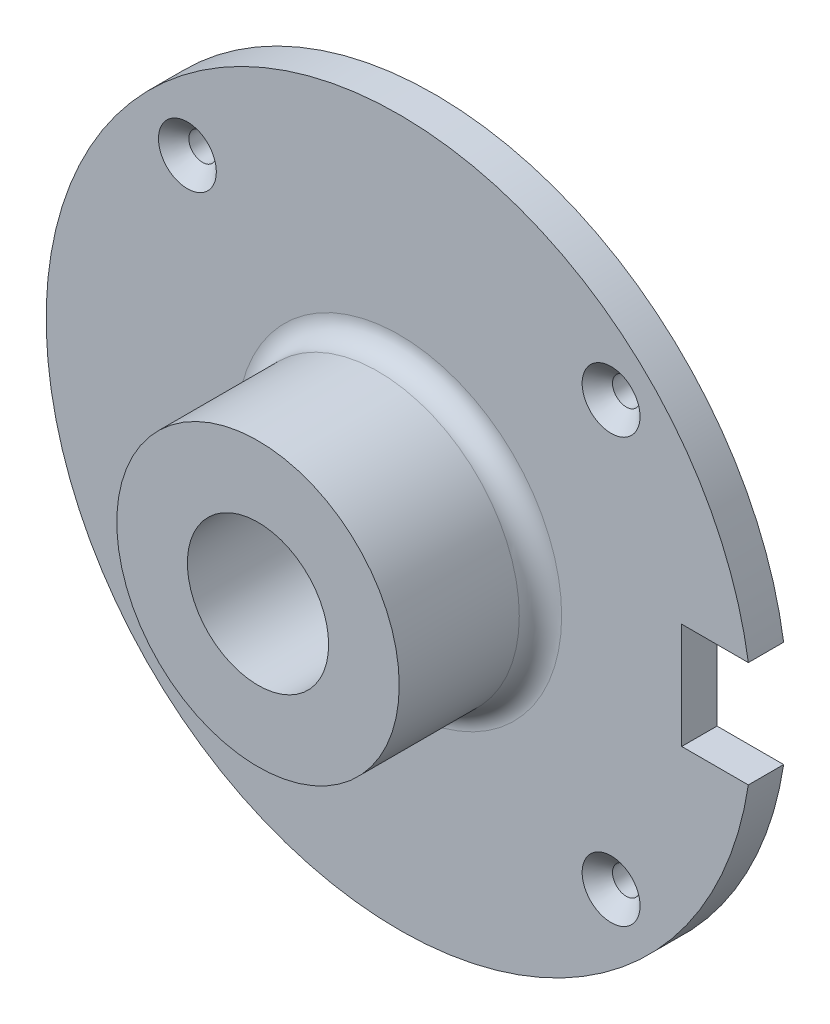
ISO-10303-21;
HEADER;
FILE_DESCRIPTION(('STEP AP214'),'2;1');
FILE_NAME('part.step','',(''),(''),'','','');
FILE_SCHEMA(('AUTOMOTIVE_DESIGN { 1 0 10303 214 1 1 1 1 }'));
ENDSEC;
DATA;
#1=APPLICATION_CONTEXT('core data for automotive mechanical design processes');
#2=APPLICATION_PROTOCOL_DEFINITION('international standard','automotive_design',2000,#1);
#3=PRODUCT_CONTEXT('',#1,'mechanical');
#4=PRODUCT('Part','Part','',(#3));
#5=PRODUCT_RELATED_PRODUCT_CATEGORY('part','',(#4));
#6=PRODUCT_DEFINITION_FORMATION('','',#4);
#7=PRODUCT_DEFINITION_CONTEXT('part definition',#1,'design');
#8=PRODUCT_DEFINITION('design','',#6,#7);
#9=PRODUCT_DEFINITION_SHAPE('','',#8);
#10=(LENGTH_UNIT() NAMED_UNIT(*) SI_UNIT(.MILLI.,.METRE.));
#11=(NAMED_UNIT(*) PLANE_ANGLE_UNIT() SI_UNIT($,.RADIAN.));
#12=(NAMED_UNIT(*) SI_UNIT($,.STERADIAN.) SOLID_ANGLE_UNIT());
#13=UNCERTAINTY_MEASURE_WITH_UNIT(LENGTH_MEASURE(1.E-05),#10,'distance_accuracy_value','');
#14=(GEOMETRIC_REPRESENTATION_CONTEXT(3) GLOBAL_UNCERTAINTY_ASSIGNED_CONTEXT((#13)) GLOBAL_UNIT_ASSIGNED_CONTEXT((#10,
#11,#12)) REPRESENTATION_CONTEXT('',''));
#15=CARTESIAN_POINT('',(0.,0.,0.));
#16=DIRECTION('',(0.,0.,1.));
#17=DIRECTION('',(1.,0.,0.));
#18=AXIS2_PLACEMENT_3D('',#15,#16,#17);
#19=CARTESIAN_POINT('',(0.,0.,50.));
#20=DIRECTION('',(0.,0.,1.));
#21=DIRECTION('',(1.,0.,0.));
#22=AXIS2_PLACEMENT_3D('',#19,#20,#21);
#23=CYLINDRICAL_SURFACE('',#22,50.);
#24=CARTESIAN_POINT('',(0.,0.,5.));
#25=DIRECTION('',(0.,0.,1.));
#26=DIRECTION('',(1.,0.,0.));
#27=AXIS2_PLACEMENT_3D('',#24,#25,#26);
#28=CIRCLE('',#27,50.);
#29=CARTESIAN_POINT('',(49.434299833213,7.5,5.));
#30=VERTEX_POINT('',#29);
#31=CARTESIAN_POINT('',(49.434299833213,-7.5,5.));
#32=VERTEX_POINT('',#31);
#33=EDGE_CURVE('E125',#30,#32,#28,.T.);
#34=ORIENTED_EDGE('',*,*,#33,.F.);
#35=DIRECTION('',(0.,0.,1.));
#36=VECTOR('',#35,1.);
#37=CARTESIAN_POINT('',(49.434299833213,7.5,50.));
#38=LINE('',#37,#36);
#39=CARTESIAN_POINT('',(49.434299833213,7.5,0.));
#40=VERTEX_POINT('',#39);
#41=EDGE_CURVE('E108',#30,#40,#38,.F.);
#42=ORIENTED_EDGE('',*,*,#41,.T.);
#43=CARTESIAN_POINT('',(0.,0.,0.));
#44=DIRECTION('',(0.,0.,1.));
#45=DIRECTION('',(1.,0.,0.));
#46=AXIS2_PLACEMENT_3D('',#43,#44,#45);
#47=CIRCLE('',#46,50.);
#48=CARTESIAN_POINT('',(49.434299833213,-7.5,0.));
#49=VERTEX_POINT('',#48);
#50=EDGE_CURVE('E46',#40,#49,#47,.T.);
#51=ORIENTED_EDGE('',*,*,#50,.T.);
#52=DIRECTION('',(0.,0.,1.));
#53=VECTOR('',#52,1.);
#54=CARTESIAN_POINT('',(49.434299833213,-7.5,50.));
#55=LINE('',#54,#53);
#56=EDGE_CURVE('E91',#49,#32,#55,.T.);
#57=ORIENTED_EDGE('',*,*,#56,.T.);
#58=EDGE_LOOP('',(#34,#42,#51,#57));
#59=FACE_BOUND('',#58,.T.);
#60=ADVANCED_FACE('F38',(#59),#23,.T.);
#61=CARTESIAN_POINT('',(0.,50.,0.));
#62=DIRECTION('',(0.,0.,1.));
#63=DIRECTION('',(1.,0.,0.));
#64=AXIS2_PLACEMENT_3D('',#61,#62,#63);
#65=PLANE('',#64);
#66=CARTESIAN_POINT('',(29.9999999999997,30.0000000000003,0.));
#67=DIRECTION('',(0.,0.,1.));
#68=DIRECTION('',(1.,0.,0.));
#69=AXIS2_PLACEMENT_3D('',#66,#67,#68);
#70=CIRCLE('',#69,1.95);
#71=CARTESIAN_POINT('',(31.9499999999997,30.0000000000003,0.));
#72=VERTEX_POINT('',#71);
#73=EDGE_CURVE('E342',#72,#72,#70,.T.);
#74=ORIENTED_EDGE('',*,*,#73,.T.);
#75=EDGE_LOOP('',(#74));
#76=FACE_BOUND('',#75,.T.);
#77=CARTESIAN_POINT('',(30.0000000000002,-29.9999999999998,0.));
#78=DIRECTION('',(0.,0.,1.));
#79=DIRECTION('',(1.,0.,0.));
#80=AXIS2_PLACEMENT_3D('',#77,#78,#79);
#81=CIRCLE('',#80,1.95);
#82=CARTESIAN_POINT('',(31.9500000000002,-29.9999999999998,0.));
#83=VERTEX_POINT('',#82);
#84=EDGE_CURVE('E333',#83,#83,#81,.T.);
#85=ORIENTED_EDGE('',*,*,#84,.T.);
#86=EDGE_LOOP('',(#85));
#87=FACE_BOUND('',#86,.T.);
#88=CARTESIAN_POINT('',(-29.9999999999999,-30.0000000000001,0.));
#89=DIRECTION('',(0.,0.,1.));
#90=DIRECTION('',(1.,0.,0.));
#91=AXIS2_PLACEMENT_3D('',#88,#89,#90);
#92=CIRCLE('',#91,1.95);
#93=CARTESIAN_POINT('',(-28.0499999999999,-30.0000000000001,0.));
#94=VERTEX_POINT('',#93);
#95=EDGE_CURVE('E322',#94,#94,#92,.T.);
#96=ORIENTED_EDGE('',*,*,#95,.T.);
#97=EDGE_LOOP('',(#96));
#98=FACE_BOUND('',#97,.T.);
#99=CARTESIAN_POINT('',(-30.,30.,0.));
#100=DIRECTION('',(0.,0.,1.));
#101=DIRECTION('',(1.,0.,0.));
#102=AXIS2_PLACEMENT_3D('',#99,#100,#101);
#103=CIRCLE('',#102,1.95);
#104=CARTESIAN_POINT('',(-28.05,30.,0.));
#105=VERTEX_POINT('',#104);
#106=EDGE_CURVE('E101',#105,#105,#103,.T.);
#107=ORIENTED_EDGE('',*,*,#106,.T.);
#108=EDGE_LOOP('',(#107));
#109=FACE_BOUND('',#108,.T.);
#110=ORIENTED_EDGE('',*,*,#50,.F.);
#111=DIRECTION('',(-1.,0.,0.));
#112=VECTOR('',#111,1.);
#113=CARTESIAN_POINT('',(40.,7.5,0.));
#114=LINE('',#113,#112);
#115=CARTESIAN_POINT('',(40.,7.5,0.));
#116=VERTEX_POINT('',#115);
#117=EDGE_CURVE('E61',#40,#116,#114,.T.);
#118=ORIENTED_EDGE('',*,*,#117,.T.);
#119=DIRECTION('',(0.,-1.,0.));
#120=VECTOR('',#119,1.);
#121=CARTESIAN_POINT('',(40.,-7.5,0.));
#122=LINE('',#121,#120);
#123=CARTESIAN_POINT('',(40.,-7.5,0.));
#124=VERTEX_POINT('',#123);
#125=EDGE_CURVE('E82',#116,#124,#122,.T.);
#126=ORIENTED_EDGE('',*,*,#125,.T.);
#127=DIRECTION('',(1.,0.,0.));
#128=VECTOR('',#127,1.);
#129=CARTESIAN_POINT('',(40.,-7.5,0.));
#130=LINE('',#129,#128);
#131=EDGE_CURVE('E88',#124,#49,#130,.T.);
#132=ORIENTED_EDGE('',*,*,#131,.T.);
#133=EDGE_LOOP('',(#110,#118,#126,#132));
#134=FACE_BOUND('',#133,.T.);
#135=CARTESIAN_POINT('',(0.,0.,0.));
#136=DIRECTION('',(0.,0.,1.));
#137=DIRECTION('',(1.,0.,0.));
#138=AXIS2_PLACEMENT_3D('',#135,#136,#137);
#139=CIRCLE('',#138,10.);
#140=CARTESIAN_POINT('',(10.,0.,0.));
#141=VERTEX_POINT('',#140);
#142=EDGE_CURVE('E110',#141,#141,#139,.T.);
#143=ORIENTED_EDGE('',*,*,#142,.T.);
#144=EDGE_LOOP('',(#143));
#145=FACE_BOUND('',#144,.T.);
#146=ADVANCED_FACE('F40',(#76,#87,#98,#109,#134,#145),#65,.F.);
#147=CARTESIAN_POINT('',(0.,23.,5.));
#148=DIRECTION('',(0.,0.,-1.));
#149=DIRECTION('',(-1.,0.,0.));
#150=AXIS2_PLACEMENT_3D('',#147,#148,#149);
#151=PLANE('',#150);
#152=CARTESIAN_POINT('',(29.9999999999997,30.0000000000003,5.));
#153=DIRECTION('',(0.,0.,1.));
#154=DIRECTION('',(1.,0.,0.));
#155=AXIS2_PLACEMENT_3D('',#152,#153,#154);
#156=CIRCLE('',#155,4.1);
#157=CARTESIAN_POINT('',(34.0999999999997,30.0000000000003,5.));
#158=VERTEX_POINT('',#157);
#159=EDGE_CURVE('E348',#158,#158,#156,.T.);
#160=ORIENTED_EDGE('',*,*,#159,.F.);
#161=EDGE_LOOP('',(#160));
#162=FACE_BOUND('',#161,.T.);
#163=CARTESIAN_POINT('',(30.0000000000002,-29.9999999999998,5.));
#164=DIRECTION('',(0.,0.,1.));
#165=DIRECTION('',(1.,0.,0.));
#166=AXIS2_PLACEMENT_3D('',#163,#164,#165);
#167=CIRCLE('',#166,4.1);
#168=CARTESIAN_POINT('',(34.1000000000002,-29.9999999999998,5.));
#169=VERTEX_POINT('',#168);
#170=EDGE_CURVE('E339',#169,#169,#167,.T.);
#171=ORIENTED_EDGE('',*,*,#170,.F.);
#172=EDGE_LOOP('',(#171));
#173=FACE_BOUND('',#172,.T.);
#174=CARTESIAN_POINT('',(-29.9999999999999,-30.0000000000001,5.));
#175=DIRECTION('',(0.,0.,1.));
#176=DIRECTION('',(1.,0.,0.));
#177=AXIS2_PLACEMENT_3D('',#174,#175,#176);
#178=CIRCLE('',#177,4.1);
#179=CARTESIAN_POINT('',(-25.8999999999999,-30.0000000000001,5.));
#180=VERTEX_POINT('',#179);
#181=EDGE_CURVE('E330',#180,#180,#178,.T.);
#182=ORIENTED_EDGE('',*,*,#181,.F.);
#183=EDGE_LOOP('',(#182));
#184=FACE_BOUND('',#183,.T.);
#185=CARTESIAN_POINT('',(-30.,30.,5.));
#186=DIRECTION('',(0.,0.,1.));
#187=DIRECTION('',(1.,0.,0.));
#188=AXIS2_PLACEMENT_3D('',#185,#186,#187);
#189=CIRCLE('',#188,4.1);
#190=CARTESIAN_POINT('',(-25.9,30.,5.));
#191=VERTEX_POINT('',#190);
#192=EDGE_CURVE('E320',#191,#191,#189,.T.);
#193=ORIENTED_EDGE('',*,*,#192,.F.);
#194=EDGE_LOOP('',(#193));
#195=FACE_BOUND('',#194,.T.);
#196=CARTESIAN_POINT('',(0.,0.,5.));
#197=DIRECTION('',(0.,0.,1.));
#198=DIRECTION('',(1.,0.,0.));
#199=AXIS2_PLACEMENT_3D('',#196,#197,#198);
#200=CIRCLE('',#199,23.);
#201=CARTESIAN_POINT('',(23.,0.,5.));
#202=VERTEX_POINT('',#201);
#203=EDGE_CURVE('E122',#202,#202,#200,.T.);
#204=ORIENTED_EDGE('',*,*,#203,.F.);
#205=EDGE_LOOP('',(#204));
#206=FACE_BOUND('',#205,.T.);
#207=DIRECTION('',(0.,-1.,0.));
#208=VECTOR('',#207,1.);
#209=CARTESIAN_POINT('',(40.,-7.5,5.));
#210=LINE('',#209,#208);
#211=CARTESIAN_POINT('',(40.,7.5,5.));
#212=VERTEX_POINT('',#211);
#213=CARTESIAN_POINT('',(40.,-7.5,5.));
#214=VERTEX_POINT('',#213);
#215=EDGE_CURVE('E53',#212,#214,#210,.T.);
#216=ORIENTED_EDGE('',*,*,#215,.F.);
#217=DIRECTION('',(1.,0.,0.));
#218=VECTOR('',#217,1.);
#219=CARTESIAN_POINT('',(0.,7.5,5.));
#220=LINE('',#219,#218);
#221=EDGE_CURVE('E11',#212,#30,#220,.T.);
#222=ORIENTED_EDGE('',*,*,#221,.T.);
#223=ORIENTED_EDGE('',*,*,#33,.T.);
#224=DIRECTION('',(1.,0.,0.));
#225=VECTOR('',#224,1.);
#226=CARTESIAN_POINT('',(40.,-7.5,5.));
#227=LINE('',#226,#225);
#228=EDGE_CURVE('E97',#214,#32,#227,.T.);
#229=ORIENTED_EDGE('',*,*,#228,.F.);
#230=EDGE_LOOP('',(#216,#222,#223,#229));
#231=FACE_BOUND('',#230,.T.);
#232=ADVANCED_FACE('F131',(#162,#173,#184,#195,#206,#231),#151,.F.);
#233=CARTESIAN_POINT('',(0.,0.,8.));
#234=DIRECTION('',(0.,0.,1.));
#235=DIRECTION('',(1.,0.,0.));
#236=AXIS2_PLACEMENT_3D('',#233,#234,#235);
#237=TOROIDAL_SURFACE('',#236,23.,3.);
#238=CARTESIAN_POINT('',(0.,0.,8.00000000000002));
#239=DIRECTION('',(0.,0.,1.));
#240=DIRECTION('',(1.,0.,0.));
#241=AXIS2_PLACEMENT_3D('',#238,#239,#240);
#242=CIRCLE('',#241,20.);
#243=CARTESIAN_POINT('',(20.,0.,8.00000000000002));
#244=VERTEX_POINT('',#243);
#245=EDGE_CURVE('E119',#244,#244,#242,.T.);
#246=ORIENTED_EDGE('',*,*,#245,.F.);
#247=EDGE_LOOP('',(#246));
#248=FACE_BOUND('',#247,.T.);
#249=ORIENTED_EDGE('',*,*,#203,.T.);
#250=EDGE_LOOP('',(#249));
#251=FACE_BOUND('',#250,.T.);
#252=ADVANCED_FACE('F133',(#248,#251),#237,.F.);
#253=CARTESIAN_POINT('',(0.,0.,50.));
#254=DIRECTION('',(0.,0.,1.));
#255=DIRECTION('',(1.,0.,0.));
#256=AXIS2_PLACEMENT_3D('',#253,#254,#255);
#257=CYLINDRICAL_SURFACE('',#256,20.);
#258=CARTESIAN_POINT('',(0.,0.,25.));
#259=DIRECTION('',(0.,0.,1.));
#260=DIRECTION('',(1.,0.,0.));
#261=AXIS2_PLACEMENT_3D('',#258,#259,#260);
#262=CIRCLE('',#261,20.);
#263=CARTESIAN_POINT('',(20.,0.,25.));
#264=VERTEX_POINT('',#263);
#265=EDGE_CURVE('E116',#264,#264,#262,.T.);
#266=ORIENTED_EDGE('',*,*,#265,.F.);
#267=EDGE_LOOP('',(#266));
#268=FACE_BOUND('',#267,.T.);
#269=ORIENTED_EDGE('',*,*,#245,.T.);
#270=EDGE_LOOP('',(#269));
#271=FACE_BOUND('',#270,.T.);
#272=ADVANCED_FACE('F140',(#268,#271),#257,.T.);
#273=CARTESIAN_POINT('',(0.,10.,25.));
#274=DIRECTION('',(0.,0.,-1.));
#275=DIRECTION('',(-1.,0.,0.));
#276=AXIS2_PLACEMENT_3D('',#273,#274,#275);
#277=PLANE('',#276);
#278=CARTESIAN_POINT('',(0.,0.,25.));
#279=DIRECTION('',(0.,0.,1.));
#280=DIRECTION('',(1.,0.,0.));
#281=AXIS2_PLACEMENT_3D('',#278,#279,#280);
#282=CIRCLE('',#281,10.);
#283=CARTESIAN_POINT('',(10.,0.,25.));
#284=VERTEX_POINT('',#283);
#285=EDGE_CURVE('E113',#284,#284,#282,.T.);
#286=ORIENTED_EDGE('',*,*,#285,.F.);
#287=EDGE_LOOP('',(#286));
#288=FACE_BOUND('',#287,.T.);
#289=ORIENTED_EDGE('',*,*,#265,.T.);
#290=EDGE_LOOP('',(#289));
#291=FACE_BOUND('',#290,.T.);
#292=ADVANCED_FACE('F248',(#288,#291),#277,.F.);
#293=CARTESIAN_POINT('',(0.,0.,50.));
#294=DIRECTION('',(0.,0.,1.));
#295=DIRECTION('',(1.,0.,0.));
#296=AXIS2_PLACEMENT_3D('',#293,#294,#295);
#297=CYLINDRICAL_SURFACE('',#296,10.);
#298=ORIENTED_EDGE('',*,*,#142,.F.);
#299=EDGE_LOOP('',(#298));
#300=FACE_BOUND('',#299,.T.);
#301=ORIENTED_EDGE('',*,*,#285,.T.);
#302=EDGE_LOOP('',(#301));
#303=FACE_BOUND('',#302,.T.);
#304=ADVANCED_FACE('F241',(#300,#303),#297,.F.);
#305=CARTESIAN_POINT('',(40.,7.5,0.));
#306=DIRECTION('',(0.,1.,0.));
#307=DIRECTION('',(0.,0.,1.));
#308=AXIS2_PLACEMENT_3D('',#305,#306,#307);
#309=PLANE('',#308);
#310=ORIENTED_EDGE('',*,*,#221,.F.);
#311=DIRECTION('',(0.,0.,1.));
#312=VECTOR('',#311,1.);
#313=CARTESIAN_POINT('',(40.,7.5,0.));
#314=LINE('',#313,#312);
#315=EDGE_CURVE('E85',#116,#212,#314,.T.);
#316=ORIENTED_EDGE('',*,*,#315,.F.);
#317=ORIENTED_EDGE('',*,*,#117,.F.);
#318=ORIENTED_EDGE('',*,*,#41,.F.);
#319=EDGE_LOOP('',(#310,#316,#317,#318));
#320=FACE_BOUND('',#319,.T.);
#321=ADVANCED_FACE('F129',(#320),#309,.F.);
#322=CARTESIAN_POINT('',(40.,-7.5,0.));
#323=DIRECTION('',(0.,-1.,0.));
#324=DIRECTION('',(0.,0.,-1.));
#325=AXIS2_PLACEMENT_3D('',#322,#323,#324);
#326=PLANE('',#325);
#327=ORIENTED_EDGE('',*,*,#131,.F.);
#328=DIRECTION('',(0.,0.,1.));
#329=VECTOR('',#328,1.);
#330=CARTESIAN_POINT('',(40.,-7.5,0.));
#331=LINE('',#330,#329);
#332=EDGE_CURVE('E78',#124,#214,#331,.T.);
#333=ORIENTED_EDGE('',*,*,#332,.T.);
#334=ORIENTED_EDGE('',*,*,#228,.T.);
#335=ORIENTED_EDGE('',*,*,#56,.F.);
#336=EDGE_LOOP('',(#327,#333,#334,#335));
#337=FACE_BOUND('',#336,.T.);
#338=ADVANCED_FACE('F89',(#337),#326,.F.);
#339=CARTESIAN_POINT('',(40.,-7.5,0.));
#340=DIRECTION('',(-1.,0.,0.));
#341=DIRECTION('',(0.,0.,1.));
#342=AXIS2_PLACEMENT_3D('',#339,#340,#341);
#343=PLANE('',#342);
#344=ORIENTED_EDGE('',*,*,#215,.T.);
#345=ORIENTED_EDGE('',*,*,#332,.F.);
#346=ORIENTED_EDGE('',*,*,#125,.F.);
#347=ORIENTED_EDGE('',*,*,#315,.T.);
#348=EDGE_LOOP('',(#344,#345,#346,#347));
#349=FACE_BOUND('',#348,.T.);
#350=ADVANCED_FACE('F80',(#349),#343,.F.);
#351=CARTESIAN_POINT('',(-30.,30.,5.));
#352=DIRECTION('',(0.,0.,1.));
#353=DIRECTION('',(1.,0.,0.));
#354=AXIS2_PLACEMENT_3D('',#351,#352,#353);
#355=CYLINDRICAL_SURFACE('',#354,1.95);
#356=ORIENTED_EDGE('',*,*,#106,.F.);
#357=EDGE_LOOP('',(#356));
#358=FACE_BOUND('',#357,.T.);
#359=CARTESIAN_POINT('',(-30.,30.,2.85));
#360=DIRECTION('',(0.,0.,1.));
#361=DIRECTION('',(1.,0.,0.));
#362=AXIS2_PLACEMENT_3D('',#359,#360,#361);
#363=CIRCLE('',#362,1.95);
#364=CARTESIAN_POINT('',(-28.05,30.,2.85));
#365=VERTEX_POINT('',#364);
#366=EDGE_CURVE('E319',#365,#365,#363,.T.);
#367=ORIENTED_EDGE('',*,*,#366,.T.);
#368=EDGE_LOOP('',(#367));
#369=FACE_BOUND('',#368,.T.);
#370=ADVANCED_FACE('F234',(#358,#369),#355,.F.);
#371=CARTESIAN_POINT('',(-30.,30.,5.));
#372=DIRECTION('',(0.,0.,1.));
#373=DIRECTION('',(1.,0.,0.));
#374=AXIS2_PLACEMENT_3D('',#371,#372,#373);
#375=CONICAL_SURFACE('',#374,4.1,0.785398163397448);
#376=ORIENTED_EDGE('',*,*,#366,.F.);
#377=EDGE_LOOP('',(#376));
#378=FACE_BOUND('',#377,.T.);
#379=ORIENTED_EDGE('',*,*,#192,.T.);
#380=EDGE_LOOP('',(#379));
#381=FACE_BOUND('',#380,.T.);
#382=ADVANCED_FACE('F161',(#378,#381),#375,.F.);
#383=CARTESIAN_POINT('',(-29.9999999999999,-30.0000000000001,5.));
#384=DIRECTION('',(0.,0.,1.));
#385=DIRECTION('',(1.,0.,0.));
#386=AXIS2_PLACEMENT_3D('',#383,#384,#385);
#387=CYLINDRICAL_SURFACE('',#386,1.95);
#388=ORIENTED_EDGE('',*,*,#95,.F.);
#389=EDGE_LOOP('',(#388));
#390=FACE_BOUND('',#389,.T.);
#391=CARTESIAN_POINT('',(-29.9999999999999,-30.0000000000001,2.85));
#392=DIRECTION('',(0.,0.,1.));
#393=DIRECTION('',(1.,0.,0.));
#394=AXIS2_PLACEMENT_3D('',#391,#392,#393);
#395=CIRCLE('',#394,1.95);
#396=CARTESIAN_POINT('',(-28.0499999999999,-30.0000000000001,2.85));
#397=VERTEX_POINT('',#396);
#398=EDGE_CURVE('E327',#397,#397,#395,.T.);
#399=ORIENTED_EDGE('',*,*,#398,.T.);
#400=EDGE_LOOP('',(#399));
#401=FACE_BOUND('',#400,.T.);
#402=ADVANCED_FACE('F171',(#390,#401),#387,.F.);
#403=CARTESIAN_POINT('',(-29.9999999999999,-30.0000000000001,5.));
#404=DIRECTION('',(0.,0.,1.));
#405=DIRECTION('',(1.,0.,0.));
#406=AXIS2_PLACEMENT_3D('',#403,#404,#405);
#407=CONICAL_SURFACE('',#406,4.1,0.785398163397448);
#408=ORIENTED_EDGE('',*,*,#398,.F.);
#409=EDGE_LOOP('',(#408));
#410=FACE_BOUND('',#409,.T.);
#411=ORIENTED_EDGE('',*,*,#181,.T.);
#412=EDGE_LOOP('',(#411));
#413=FACE_BOUND('',#412,.T.);
#414=ADVANCED_FACE('F176',(#410,#413),#407,.F.);
#415=CARTESIAN_POINT('',(30.0000000000002,-29.9999999999998,5.));
#416=DIRECTION('',(0.,0.,1.));
#417=DIRECTION('',(1.,0.,0.));
#418=AXIS2_PLACEMENT_3D('',#415,#416,#417);
#419=CYLINDRICAL_SURFACE('',#418,1.95);
#420=ORIENTED_EDGE('',*,*,#84,.F.);
#421=EDGE_LOOP('',(#420));
#422=FACE_BOUND('',#421,.T.);
#423=CARTESIAN_POINT('',(30.0000000000002,-29.9999999999998,2.85));
#424=DIRECTION('',(0.,0.,1.));
#425=DIRECTION('',(1.,0.,0.));
#426=AXIS2_PLACEMENT_3D('',#423,#424,#425);
#427=CIRCLE('',#426,1.95);
#428=CARTESIAN_POINT('',(31.9500000000002,-29.9999999999998,2.85));
#429=VERTEX_POINT('',#428);
#430=EDGE_CURVE('E336',#429,#429,#427,.T.);
#431=ORIENTED_EDGE('',*,*,#430,.T.);
#432=EDGE_LOOP('',(#431));
#433=FACE_BOUND('',#432,.T.);
#434=ADVANCED_FACE('F186',(#422,#433),#419,.F.);
#435=CARTESIAN_POINT('',(30.0000000000002,-29.9999999999998,5.));
#436=DIRECTION('',(0.,0.,1.));
#437=DIRECTION('',(1.,0.,0.));
#438=AXIS2_PLACEMENT_3D('',#435,#436,#437);
#439=CONICAL_SURFACE('',#438,4.1,0.78539816339745);
#440=ORIENTED_EDGE('',*,*,#430,.F.);
#441=EDGE_LOOP('',(#440));
#442=FACE_BOUND('',#441,.T.);
#443=ORIENTED_EDGE('',*,*,#170,.T.);
#444=EDGE_LOOP('',(#443));
#445=FACE_BOUND('',#444,.T.);
#446=ADVANCED_FACE('F196',(#442,#445),#439,.F.);
#447=CARTESIAN_POINT('',(29.9999999999997,30.0000000000003,5.));
#448=DIRECTION('',(0.,0.,1.));
#449=DIRECTION('',(1.,0.,0.));
#450=AXIS2_PLACEMENT_3D('',#447,#448,#449);
#451=CYLINDRICAL_SURFACE('',#450,1.95);
#452=ORIENTED_EDGE('',*,*,#73,.F.);
#453=EDGE_LOOP('',(#452));
#454=FACE_BOUND('',#453,.T.);
#455=CARTESIAN_POINT('',(29.9999999999997,30.0000000000003,2.85));
#456=DIRECTION('',(0.,0.,1.));
#457=DIRECTION('',(1.,0.,0.));
#458=AXIS2_PLACEMENT_3D('',#455,#456,#457);
#459=CIRCLE('',#458,1.95);
#460=CARTESIAN_POINT('',(31.9499999999997,30.0000000000003,2.85));
#461=VERTEX_POINT('',#460);
#462=EDGE_CURVE('E345',#461,#461,#459,.T.);
#463=ORIENTED_EDGE('',*,*,#462,.T.);
#464=EDGE_LOOP('',(#463));
#465=FACE_BOUND('',#464,.T.);
#466=ADVANCED_FACE('F206',(#454,#465),#451,.F.);
#467=CARTESIAN_POINT('',(29.9999999999997,30.0000000000003,5.));
#468=DIRECTION('',(0.,0.,1.));
#469=DIRECTION('',(1.,0.,0.));
#470=AXIS2_PLACEMENT_3D('',#467,#468,#469);
#471=CONICAL_SURFACE('',#470,4.1,0.78539816339745);
#472=ORIENTED_EDGE('',*,*,#462,.F.);
#473=EDGE_LOOP('',(#472));
#474=FACE_BOUND('',#473,.T.);
#475=ORIENTED_EDGE('',*,*,#159,.T.);
#476=EDGE_LOOP('',(#475));
#477=FACE_BOUND('',#476,.T.);
#478=ADVANCED_FACE('F216',(#474,#477),#471,.F.);
#479=CLOSED_SHELL('',(#60,#146,#232,#252,#272,#292,#304,#321,#338,#350,#370,#382,#402,#414,#434,
#446,#466,#478));
#480=MANIFOLD_SOLID_BREP('B2',#479);
#481=ADVANCED_BREP_SHAPE_REPRESENTATION('',(#18,#480),#14);
#482=SHAPE_DEFINITION_REPRESENTATION(#9,#481);
ENDSEC;
END-ISO-10303-21;
